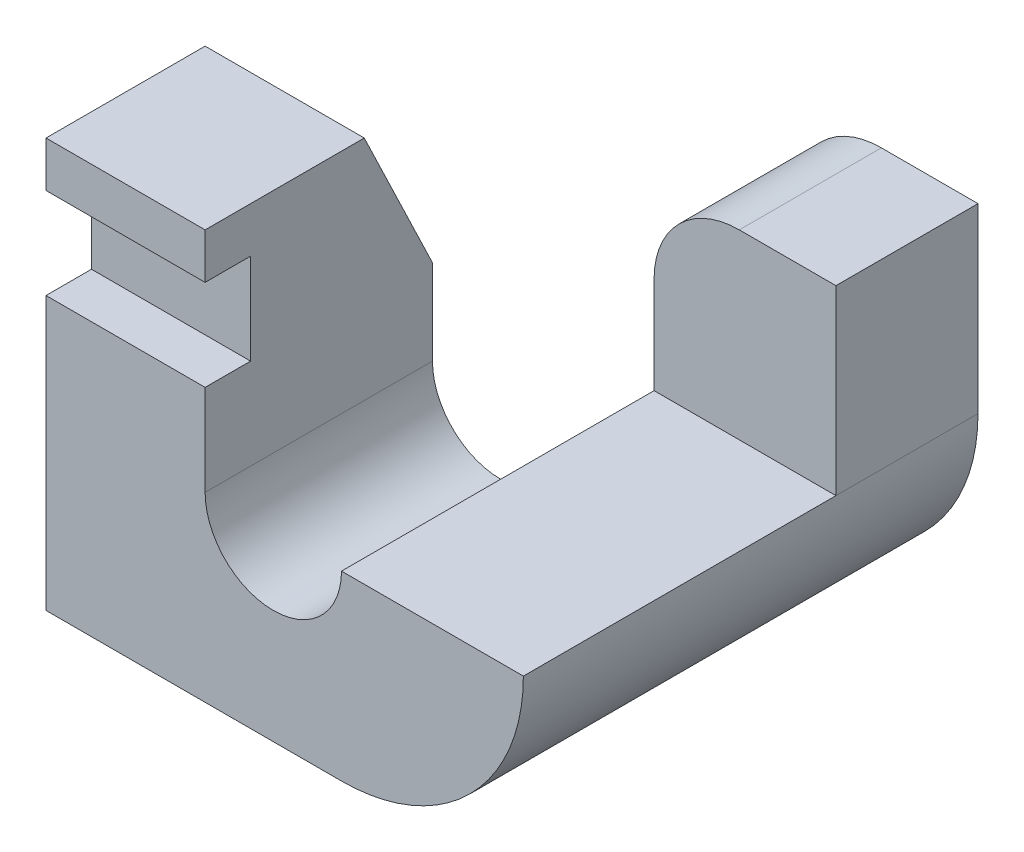
ISO-10303-21;
HEADER;
FILE_DESCRIPTION(('STEP AP214'),'2;1');
FILE_NAME('part.step','',(''),(''),'','','');
FILE_SCHEMA(('AUTOMOTIVE_DESIGN { 1 0 10303 214 1 1 1 1 }'));
ENDSEC;
DATA;
#1=APPLICATION_CONTEXT('core data for automotive mechanical design processes');
#2=APPLICATION_PROTOCOL_DEFINITION('international standard','automotive_design',2000,#1);
#3=PRODUCT_CONTEXT('',#1,'mechanical');
#4=PRODUCT('Part','Part','',(#3));
#5=PRODUCT_RELATED_PRODUCT_CATEGORY('part','',(#4));
#6=PRODUCT_DEFINITION_FORMATION('','',#4);
#7=PRODUCT_DEFINITION_CONTEXT('part definition',#1,'design');
#8=PRODUCT_DEFINITION('design','',#6,#7);
#9=PRODUCT_DEFINITION_SHAPE('','',#8);
#10=(LENGTH_UNIT() NAMED_UNIT(*) SI_UNIT(.MILLI.,.METRE.));
#11=(NAMED_UNIT(*) PLANE_ANGLE_UNIT() SI_UNIT($,.RADIAN.));
#12=(NAMED_UNIT(*) SI_UNIT($,.STERADIAN.) SOLID_ANGLE_UNIT());
#13=UNCERTAINTY_MEASURE_WITH_UNIT(LENGTH_MEASURE(1.E-05),#10,'distance_accuracy_value','');
#14=(GEOMETRIC_REPRESENTATION_CONTEXT(3) GLOBAL_UNCERTAINTY_ASSIGNED_CONTEXT((#13)) GLOBAL_UNIT_ASSIGNED_CONTEXT((#10,
#11,#12)) REPRESENTATION_CONTEXT('',''));
#15=CARTESIAN_POINT('',(0.,0.,0.));
#16=DIRECTION('',(0.,0.,1.));
#17=DIRECTION('',(1.,0.,0.));
#18=AXIS2_PLACEMENT_3D('',#15,#16,#17);
#19=CARTESIAN_POINT('',(0.,0.,80.));
#20=DIRECTION('',(1.,0.,0.));
#21=DIRECTION('',(0.,0.,-1.));
#22=AXIS2_PLACEMENT_3D('',#19,#20,#21);
#23=PLANE('',#22);
#24=DIRECTION('',(0.,0.,-1.));
#25=VECTOR('',#24,1.);
#26=CARTESIAN_POINT('',(0.,72.,80.));
#27=LINE('',#26,#25);
#28=CARTESIAN_POINT('',(0.,72.,80.));
#29=VERTEX_POINT('',#28);
#30=CARTESIAN_POINT('',(0.,72.,52.));
#31=VERTEX_POINT('',#30);
#32=EDGE_CURVE('E169',#29,#31,#27,.T.);
#33=ORIENTED_EDGE('',*,*,#32,.T.);
#34=DIRECTION('',(0.,-0.901523057468274,-0.432731067584771));
#35=VECTOR('',#34,1.);
#36=CARTESIAN_POINT('',(0.,24.405721716515,29.1547464239272));
#37=LINE('',#36,#35);
#38=CARTESIAN_POINT('',(0.,47.,40.));
#39=VERTEX_POINT('',#38);
#40=EDGE_CURVE('E149',#31,#39,#37,.T.);
#41=ORIENTED_EDGE('',*,*,#40,.T.);
#42=DIRECTION('',(0.,1.,0.));
#43=VECTOR('',#42,1.);
#44=CARTESIAN_POINT('',(0.,0.,40.));
#45=LINE('',#44,#43);
#46=CARTESIAN_POINT('',(0.,0.,40.));
#47=VERTEX_POINT('',#46);
#48=EDGE_CURVE('E262',#47,#39,#45,.T.);
#49=ORIENTED_EDGE('',*,*,#48,.F.);
#50=DIRECTION('',(0.,0.,-1.));
#51=VECTOR('',#50,1.);
#52=CARTESIAN_POINT('',(0.,0.,80.));
#53=LINE('',#52,#51);
#54=CARTESIAN_POINT('',(0.,0.,80.));
#55=VERTEX_POINT('',#54);
#56=EDGE_CURVE('E184',#55,#47,#53,.T.);
#57=ORIENTED_EDGE('',*,*,#56,.F.);
#58=DIRECTION('',(0.,-1.,0.));
#59=VECTOR('',#58,1.);
#60=CARTESIAN_POINT('',(0.,0.,80.));
#61=LINE('',#60,#59);
#62=CARTESIAN_POINT('',(0.,48.,80.));
#63=VERTEX_POINT('',#62);
#64=EDGE_CURVE('E205',#63,#55,#61,.T.);
#65=ORIENTED_EDGE('',*,*,#64,.F.);
#66=DIRECTION('',(0.,0.,1.));
#67=VECTOR('',#66,1.);
#68=CARTESIAN_POINT('',(0.,48.,80.));
#69=LINE('',#68,#67);
#70=CARTESIAN_POINT('',(0.,48.,72.));
#71=VERTEX_POINT('',#70);
#72=EDGE_CURVE('E259',#71,#63,#69,.T.);
#73=ORIENTED_EDGE('',*,*,#72,.F.);
#74=DIRECTION('',(0.,-1.,0.));
#75=VECTOR('',#74,1.);
#76=CARTESIAN_POINT('',(0.,0.,72.));
#77=LINE('',#76,#75);
#78=CARTESIAN_POINT('',(0.,64.,72.));
#79=VERTEX_POINT('',#78);
#80=EDGE_CURVE('E319',#79,#71,#77,.T.);
#81=ORIENTED_EDGE('',*,*,#80,.F.);
#82=DIRECTION('',(0.,0.,-1.));
#83=VECTOR('',#82,1.);
#84=CARTESIAN_POINT('',(0.,64.,80.));
#85=LINE('',#84,#83);
#86=CARTESIAN_POINT('',(0.,64.,80.));
#87=VERTEX_POINT('',#86);
#88=EDGE_CURVE('E322',#87,#79,#85,.T.);
#89=ORIENTED_EDGE('',*,*,#88,.F.);
#90=EDGE_CURVE('E193',#29,#87,#61,.T.);
#91=ORIENTED_EDGE('',*,*,#90,.F.);
#92=EDGE_LOOP('',(#33,#41,#49,#57,#65,#73,#81,#89,#91));
#93=FACE_BOUND('',#92,.T.);
#94=ADVANCED_FACE('F33',(#93),#23,.F.);
#95=CARTESIAN_POINT('',(28.,72.,80.));
#96=DIRECTION('',(-1.,0.,0.));
#97=DIRECTION('',(0.,-1.,0.));
#98=AXIS2_PLACEMENT_3D('',#95,#96,#97);
#99=PLANE('',#98);
#100=DIRECTION('',(0.,-1.,0.));
#101=VECTOR('',#100,1.);
#102=CARTESIAN_POINT('',(28.,72.,40.));
#103=LINE('',#102,#101);
#104=CARTESIAN_POINT('',(28.,47.,40.));
#105=VERTEX_POINT('',#104);
#106=CARTESIAN_POINT('',(28.,32.,40.));
#107=VERTEX_POINT('',#106);
#108=EDGE_CURVE('E163',#105,#107,#103,.T.);
#109=ORIENTED_EDGE('',*,*,#108,.F.);
#110=DIRECTION('',(0.,-0.901523057468274,-0.432731067584771));
#111=VECTOR('',#110,1.);
#112=CARTESIAN_POINT('',(28.,-6.8036410923277,14.1742522756827));
#113=LINE('',#112,#111);
#114=CARTESIAN_POINT('',(28.,72.,52.));
#115=VERTEX_POINT('',#114);
#116=EDGE_CURVE('E55',#115,#105,#113,.T.);
#117=ORIENTED_EDGE('',*,*,#116,.F.);
#118=DIRECTION('',(0.,0.,-1.));
#119=VECTOR('',#118,1.);
#120=CARTESIAN_POINT('',(28.,72.,80.));
#121=LINE('',#120,#119);
#122=CARTESIAN_POINT('',(28.,72.,80.));
#123=VERTEX_POINT('',#122);
#124=EDGE_CURVE('E160',#123,#115,#121,.T.);
#125=ORIENTED_EDGE('',*,*,#124,.F.);
#126=DIRECTION('',(0.,1.,0.));
#127=VECTOR('',#126,1.);
#128=CARTESIAN_POINT('',(28.,72.,80.));
#129=LINE('',#128,#127);
#130=CARTESIAN_POINT('',(28.,64.,80.));
#131=VERTEX_POINT('',#130);
#132=EDGE_CURVE('E191',#131,#123,#129,.T.);
#133=ORIENTED_EDGE('',*,*,#132,.F.);
#134=DIRECTION('',(0.,0.,-1.));
#135=VECTOR('',#134,1.);
#136=CARTESIAN_POINT('',(28.,64.,0.));
#137=LINE('',#136,#135);
#138=CARTESIAN_POINT('',(28.,64.,72.));
#139=VERTEX_POINT('',#138);
#140=EDGE_CURVE('E47',#131,#139,#137,.T.);
#141=ORIENTED_EDGE('',*,*,#140,.T.);
#142=DIRECTION('',(0.,-1.,0.));
#143=VECTOR('',#142,1.);
#144=CARTESIAN_POINT('',(28.,0.,72.));
#145=LINE('',#144,#143);
#146=CARTESIAN_POINT('',(28.,48.,72.));
#147=VERTEX_POINT('',#146);
#148=EDGE_CURVE('E329',#139,#147,#145,.T.);
#149=ORIENTED_EDGE('',*,*,#148,.T.);
#150=DIRECTION('',(0.,0.,1.));
#151=VECTOR('',#150,1.);
#152=CARTESIAN_POINT('',(28.,48.,0.));
#153=LINE('',#152,#151);
#154=CARTESIAN_POINT('',(28.,48.,80.));
#155=VERTEX_POINT('',#154);
#156=EDGE_CURVE('E251',#147,#155,#153,.T.);
#157=ORIENTED_EDGE('',*,*,#156,.T.);
#158=CARTESIAN_POINT('',(28.,32.,80.));
#159=VERTEX_POINT('',#158);
#160=EDGE_CURVE('E196',#159,#155,#129,.T.);
#161=ORIENTED_EDGE('',*,*,#160,.F.);
#162=DIRECTION('',(0.,0.,-1.));
#163=VECTOR('',#162,1.);
#164=CARTESIAN_POINT('',(28.,32.,80.));
#165=LINE('',#164,#163);
#166=EDGE_CURVE('E168',#159,#107,#165,.T.);
#167=ORIENTED_EDGE('',*,*,#166,.T.);
#168=EDGE_LOOP('',(#109,#117,#125,#133,#141,#149,#157,#161,#167));
#169=FACE_BOUND('',#168,.T.);
#170=ADVANCED_FACE('F158',(#169),#99,.F.);
#171=CARTESIAN_POINT('',(40.,32.,80.));
#172=DIRECTION('',(0.,0.,1.));
#173=DIRECTION('',(1.,0.,0.));
#174=AXIS2_PLACEMENT_3D('',#171,#172,#173);
#175=PLANE('',#174);
#176=ORIENTED_EDGE('',*,*,#160,.T.);
#177=DIRECTION('',(-1.,0.,0.));
#178=VECTOR('',#177,1.);
#179=CARTESIAN_POINT('',(40.,48.,80.));
#180=LINE('',#179,#178);
#181=EDGE_CURVE('E11',#155,#63,#180,.T.);
#182=ORIENTED_EDGE('',*,*,#181,.T.);
#183=ORIENTED_EDGE('',*,*,#64,.T.);
#184=DIRECTION('',(1.,0.,0.));
#185=VECTOR('',#184,1.);
#186=CARTESIAN_POINT('',(0.,0.,80.));
#187=LINE('',#186,#185);
#188=CARTESIAN_POINT('',(52.,0.,80.));
#189=VERTEX_POINT('',#188);
#190=EDGE_CURVE('E228',#55,#189,#187,.T.);
#191=ORIENTED_EDGE('',*,*,#190,.T.);
#192=CARTESIAN_POINT('',(52.,32.,80.));
#193=DIRECTION('',(0.,0.,1.));
#194=DIRECTION('',(1.,0.,0.));
#195=AXIS2_PLACEMENT_3D('',#192,#193,#194);
#196=CIRCLE('',#195,32.);
#197=CARTESIAN_POINT('',(84.,32.,80.));
#198=VERTEX_POINT('',#197);
#199=EDGE_CURVE('E230',#189,#198,#196,.T.);
#200=ORIENTED_EDGE('',*,*,#199,.T.);
#201=DIRECTION('',(-1.,0.,0.));
#202=VECTOR('',#201,1.);
#203=CARTESIAN_POINT('',(52.,32.,80.));
#204=LINE('',#203,#202);
#205=CARTESIAN_POINT('',(52.,32.,80.));
#206=VERTEX_POINT('',#205);
#207=EDGE_CURVE('E200',#198,#206,#204,.T.);
#208=ORIENTED_EDGE('',*,*,#207,.T.);
#209=CARTESIAN_POINT('',(40.,32.,80.));
#210=DIRECTION('',(0.,0.,-1.));
#211=DIRECTION('',(1.,0.,0.));
#212=AXIS2_PLACEMENT_3D('',#209,#210,#211);
#213=CIRCLE('',#212,12.);
#214=EDGE_CURVE('E197',#206,#159,#213,.T.);
#215=ORIENTED_EDGE('',*,*,#214,.T.);
#216=EDGE_LOOP('',(#176,#182,#183,#191,#200,#208,#215));
#217=FACE_BOUND('',#216,.T.);
#218=ADVANCED_FACE('F234',(#217),#175,.T.);
#219=ORIENTED_EDGE('',*,*,#90,.T.);
#220=DIRECTION('',(1.,0.,0.));
#221=VECTOR('',#220,1.);
#222=CARTESIAN_POINT('',(40.,64.,80.));
#223=LINE('',#222,#221);
#224=EDGE_CURVE('E40',#87,#131,#223,.T.);
#225=ORIENTED_EDGE('',*,*,#224,.T.);
#226=ORIENTED_EDGE('',*,*,#132,.T.);
#227=DIRECTION('',(-1.,0.,0.));
#228=VECTOR('',#227,1.);
#229=CARTESIAN_POINT('',(0.,72.,80.));
#230=LINE('',#229,#228);
#231=EDGE_CURVE('E167',#123,#29,#230,.T.);
#232=ORIENTED_EDGE('',*,*,#231,.T.);
#233=EDGE_LOOP('',(#219,#225,#226,#232));
#234=FACE_BOUND('',#233,.T.);
#235=ADVANCED_FACE('F190',(#234),#175,.T.);
#236=CARTESIAN_POINT('',(0.,0.,80.));
#237=DIRECTION('',(0.,1.,0.));
#238=DIRECTION('',(-1.,0.,0.));
#239=AXIS2_PLACEMENT_3D('',#236,#237,#238);
#240=PLANE('',#239);
#241=DIRECTION('',(-1.,0.,0.));
#242=VECTOR('',#241,1.);
#243=CARTESIAN_POINT('',(0.,0.,40.));
#244=LINE('',#243,#242);
#245=CARTESIAN_POINT('',(52.,0.,40.));
#246=VERTEX_POINT('',#245);
#247=EDGE_CURVE('E267',#246,#47,#244,.T.);
#248=ORIENTED_EDGE('',*,*,#247,.F.);
#249=DIRECTION('',(0.,0.,-1.));
#250=VECTOR('',#249,1.);
#251=CARTESIAN_POINT('',(52.,0.,80.));
#252=LINE('',#251,#250);
#253=EDGE_CURVE('E181',#189,#246,#252,.T.);
#254=ORIENTED_EDGE('',*,*,#253,.F.);
#255=ORIENTED_EDGE('',*,*,#190,.F.);
#256=ORIENTED_EDGE('',*,*,#56,.T.);
#257=EDGE_LOOP('',(#248,#254,#255,#256));
#258=FACE_BOUND('',#257,.T.);
#259=ADVANCED_FACE('F265',(#258),#240,.F.);
#260=CARTESIAN_POINT('',(40.,32.,80.));
#261=DIRECTION('',(0.,0.,-1.));
#262=DIRECTION('',(-1.,0.,0.));
#263=AXIS2_PLACEMENT_3D('',#260,#261,#262);
#264=CYLINDRICAL_SURFACE('',#263,12.);
#265=CARTESIAN_POINT('',(40.,32.,40.));
#266=DIRECTION('',(0.,0.,-1.));
#267=DIRECTION('',(-1.,0.,0.));
#268=AXIS2_PLACEMENT_3D('',#265,#266,#267);
#269=CIRCLE('',#268,12.);
#270=CARTESIAN_POINT('',(52.,32.,40.));
#271=VERTEX_POINT('',#270);
#272=EDGE_CURVE('E248',#107,#271,#269,.F.);
#273=ORIENTED_EDGE('',*,*,#272,.F.);
#274=ORIENTED_EDGE('',*,*,#166,.F.);
#275=ORIENTED_EDGE('',*,*,#214,.F.);
#276=DIRECTION('',(0.,0.,-1.));
#277=VECTOR('',#276,1.);
#278=CARTESIAN_POINT('',(52.,32.,80.));
#279=LINE('',#278,#277);
#280=EDGE_CURVE('E171',#206,#271,#279,.T.);
#281=ORIENTED_EDGE('',*,*,#280,.T.);
#282=EDGE_LOOP('',(#273,#274,#275,#281));
#283=FACE_BOUND('',#282,.T.);
#284=ADVANCED_FACE('F246',(#283),#264,.F.);
#285=CARTESIAN_POINT('',(0.,72.,80.));
#286=DIRECTION('',(0.,-1.,0.));
#287=DIRECTION('',(0.,0.,-1.));
#288=AXIS2_PLACEMENT_3D('',#285,#286,#287);
#289=PLANE('',#288);
#290=ORIENTED_EDGE('',*,*,#124,.T.);
#291=DIRECTION('',(1.,0.,0.));
#292=VECTOR('',#291,1.);
#293=CARTESIAN_POINT('',(-27.,72.,52.));
#294=LINE('',#293,#292);
#295=EDGE_CURVE('E146',#31,#115,#294,.T.);
#296=ORIENTED_EDGE('',*,*,#295,.F.);
#297=ORIENTED_EDGE('',*,*,#32,.F.);
#298=ORIENTED_EDGE('',*,*,#231,.F.);
#299=EDGE_LOOP('',(#290,#296,#297,#298));
#300=FACE_BOUND('',#299,.T.);
#301=ADVANCED_FACE('F166',(#300),#289,.F.);
#302=CARTESIAN_POINT('',(52.,32.,80.));
#303=DIRECTION('',(0.,-1.,0.));
#304=DIRECTION('',(1.,0.,0.));
#305=AXIS2_PLACEMENT_3D('',#302,#303,#304);
#306=PLANE('',#305);
#307=DIRECTION('',(-1.,0.,0.));
#308=VECTOR('',#307,1.);
#309=CARTESIAN_POINT('',(52.,32.,25.));
#310=LINE('',#309,#308);
#311=CARTESIAN_POINT('',(84.,32.,25.));
#312=VERTEX_POINT('',#311);
#313=CARTESIAN_POINT('',(52.,32.,25.));
#314=VERTEX_POINT('',#313);
#315=EDGE_CURVE('E270',#312,#314,#310,.T.);
#316=ORIENTED_EDGE('',*,*,#315,.T.);
#317=DIRECTION('',(0.,0.,-1.));
#318=VECTOR('',#317,1.);
#319=CARTESIAN_POINT('',(52.,32.,80.));
#320=LINE('',#319,#318);
#321=EDGE_CURVE('E243',#314,#271,#320,.F.);
#322=ORIENTED_EDGE('',*,*,#321,.T.);
#323=ORIENTED_EDGE('',*,*,#280,.F.);
#324=ORIENTED_EDGE('',*,*,#207,.F.);
#325=DIRECTION('',(0.,0.,-1.));
#326=VECTOR('',#325,1.);
#327=CARTESIAN_POINT('',(84.,32.,80.));
#328=LINE('',#327,#326);
#329=EDGE_CURVE('E178',#198,#312,#328,.T.);
#330=ORIENTED_EDGE('',*,*,#329,.T.);
#331=EDGE_LOOP('',(#316,#322,#323,#324,#330));
#332=FACE_BOUND('',#331,.T.);
#333=ADVANCED_FACE('F242',(#332),#306,.F.);
#334=CARTESIAN_POINT('',(52.,32.,80.));
#335=DIRECTION('',(0.,0.,-1.));
#336=DIRECTION('',(-1.,0.,0.));
#337=AXIS2_PLACEMENT_3D('',#334,#335,#336);
#338=CYLINDRICAL_SURFACE('',#337,32.);
#339=CARTESIAN_POINT('',(52.,32.,0.));
#340=DIRECTION('',(0.,0.,1.));
#341=DIRECTION('',(1.,0.,0.));
#342=AXIS2_PLACEMENT_3D('',#339,#340,#341);
#343=CIRCLE('',#342,32.);
#344=CARTESIAN_POINT('',(52.,0.,0.));
#345=VERTEX_POINT('',#344);
#346=CARTESIAN_POINT('',(84.,32.,0.));
#347=VERTEX_POINT('',#346);
#348=EDGE_CURVE('E204',#345,#347,#343,.T.);
#349=ORIENTED_EDGE('',*,*,#348,.T.);
#350=DIRECTION('',(0.,0.,-1.));
#351=VECTOR('',#350,1.);
#352=CARTESIAN_POINT('',(84.,32.,25.));
#353=LINE('',#352,#351);
#354=EDGE_CURVE('E225',#312,#347,#353,.T.);
#355=ORIENTED_EDGE('',*,*,#354,.F.);
#356=ORIENTED_EDGE('',*,*,#329,.F.);
#357=ORIENTED_EDGE('',*,*,#199,.F.);
#358=ORIENTED_EDGE('',*,*,#253,.T.);
#359=DIRECTION('',(0.,0.,-1.));
#360=VECTOR('',#359,1.);
#361=CARTESIAN_POINT('',(52.,0.,0.));
#362=LINE('',#361,#360);
#363=EDGE_CURVE('E315',#246,#345,#362,.T.);
#364=ORIENTED_EDGE('',*,*,#363,.T.);
#365=EDGE_LOOP('',(#349,#355,#356,#357,#358,#364));
#366=FACE_BOUND('',#365,.T.);
#367=ADVANCED_FACE('F268',(#366),#338,.T.);
#368=CARTESIAN_POINT('',(40.,32.,0.));
#369=DIRECTION('',(0.,0.,1.));
#370=DIRECTION('',(1.,0.,0.));
#371=AXIS2_PLACEMENT_3D('',#368,#369,#370);
#372=PLANE('',#371);
#373=ORIENTED_EDGE('',*,*,#348,.F.);
#374=DIRECTION('',(0.,1.,0.));
#375=VECTOR('',#374,1.);
#376=CARTESIAN_POINT('',(52.,32.,0.));
#377=LINE('',#376,#375);
#378=CARTESIAN_POINT('',(52.,49.,0.));
#379=VERTEX_POINT('',#378);
#380=EDGE_CURVE('E298',#345,#379,#377,.T.);
#381=ORIENTED_EDGE('',*,*,#380,.T.);
#382=CARTESIAN_POINT('',(67.,49.,0.));
#383=DIRECTION('',(0.,0.,-1.));
#384=DIRECTION('',(-1.,0.,0.));
#385=AXIS2_PLACEMENT_3D('',#382,#383,#384);
#386=CIRCLE('',#385,15.);
#387=CARTESIAN_POINT('',(67.,64.,0.));
#388=VERTEX_POINT('',#387);
#389=EDGE_CURVE('E287',#379,#388,#386,.T.);
#390=ORIENTED_EDGE('',*,*,#389,.T.);
#391=DIRECTION('',(1.,0.,0.));
#392=VECTOR('',#391,1.);
#393=CARTESIAN_POINT('',(67.,64.,0.));
#394=LINE('',#393,#392);
#395=CARTESIAN_POINT('',(84.,64.,0.));
#396=VERTEX_POINT('',#395);
#397=EDGE_CURVE('E221',#388,#396,#394,.T.);
#398=ORIENTED_EDGE('',*,*,#397,.T.);
#399=DIRECTION('',(0.,-1.,0.));
#400=VECTOR('',#399,1.);
#401=CARTESIAN_POINT('',(84.,64.,0.));
#402=LINE('',#401,#400);
#403=EDGE_CURVE('E296',#396,#347,#402,.T.);
#404=ORIENTED_EDGE('',*,*,#403,.T.);
#405=EDGE_LOOP('',(#373,#381,#390,#398,#404));
#406=FACE_BOUND('',#405,.T.);
#407=ADVANCED_FACE('F303',(#406),#372,.F.);
#408=CARTESIAN_POINT('',(84.,64.,25.));
#409=DIRECTION('',(1.,0.,0.));
#410=DIRECTION('',(0.,0.,-1.));
#411=AXIS2_PLACEMENT_3D('',#408,#409,#410);
#412=PLANE('',#411);
#413=ORIENTED_EDGE('',*,*,#403,.F.);
#414=DIRECTION('',(0.,0.,-1.));
#415=VECTOR('',#414,1.);
#416=CARTESIAN_POINT('',(84.,64.,25.));
#417=LINE('',#416,#415);
#418=CARTESIAN_POINT('',(84.,64.,25.));
#419=VERTEX_POINT('',#418);
#420=EDGE_CURVE('E206',#419,#396,#417,.T.);
#421=ORIENTED_EDGE('',*,*,#420,.F.);
#422=DIRECTION('',(0.,-1.,0.));
#423=VECTOR('',#422,1.);
#424=CARTESIAN_POINT('',(84.,64.,25.));
#425=LINE('',#424,#423);
#426=EDGE_CURVE('E277',#419,#312,#425,.T.);
#427=ORIENTED_EDGE('',*,*,#426,.T.);
#428=ORIENTED_EDGE('',*,*,#354,.T.);
#429=EDGE_LOOP('',(#413,#421,#427,#428));
#430=FACE_BOUND('',#429,.T.);
#431=ADVANCED_FACE('F283',(#430),#412,.T.);
#432=CARTESIAN_POINT('',(67.,64.,25.));
#433=DIRECTION('',(0.,1.,0.));
#434=DIRECTION('',(0.,0.,1.));
#435=AXIS2_PLACEMENT_3D('',#432,#433,#434);
#436=PLANE('',#435);
#437=ORIENTED_EDGE('',*,*,#397,.F.);
#438=DIRECTION('',(0.,0.,-1.));
#439=VECTOR('',#438,1.);
#440=CARTESIAN_POINT('',(67.,64.,25.));
#441=LINE('',#440,#439);
#442=CARTESIAN_POINT('',(67.,64.,25.));
#443=VERTEX_POINT('',#442);
#444=EDGE_CURVE('E212',#443,#388,#441,.T.);
#445=ORIENTED_EDGE('',*,*,#444,.F.);
#446=DIRECTION('',(1.,0.,0.));
#447=VECTOR('',#446,1.);
#448=CARTESIAN_POINT('',(67.,64.,25.));
#449=LINE('',#448,#447);
#450=EDGE_CURVE('E226',#443,#419,#449,.T.);
#451=ORIENTED_EDGE('',*,*,#450,.T.);
#452=ORIENTED_EDGE('',*,*,#420,.T.);
#453=EDGE_LOOP('',(#437,#445,#451,#452));
#454=FACE_BOUND('',#453,.T.);
#455=ADVANCED_FACE('F305',(#454),#436,.T.);
#456=CARTESIAN_POINT('',(67.,49.,25.));
#457=DIRECTION('',(0.,0.,-1.));
#458=DIRECTION('',(-1.,0.,0.));
#459=AXIS2_PLACEMENT_3D('',#456,#457,#458);
#460=CYLINDRICAL_SURFACE('',#459,15.);
#461=ORIENTED_EDGE('',*,*,#389,.F.);
#462=DIRECTION('',(0.,0.,-1.));
#463=VECTOR('',#462,1.);
#464=CARTESIAN_POINT('',(52.,49.,25.));
#465=LINE('',#464,#463);
#466=CARTESIAN_POINT('',(52.,49.,25.));
#467=VERTEX_POINT('',#466);
#468=EDGE_CURVE('E218',#467,#379,#465,.T.);
#469=ORIENTED_EDGE('',*,*,#468,.F.);
#470=CARTESIAN_POINT('',(67.,49.,25.));
#471=DIRECTION('',(0.,0.,-1.));
#472=DIRECTION('',(-1.,0.,0.));
#473=AXIS2_PLACEMENT_3D('',#470,#471,#472);
#474=CIRCLE('',#473,15.);
#475=EDGE_CURVE('E292',#467,#443,#474,.T.);
#476=ORIENTED_EDGE('',*,*,#475,.T.);
#477=ORIENTED_EDGE('',*,*,#444,.T.);
#478=EDGE_LOOP('',(#461,#469,#476,#477));
#479=FACE_BOUND('',#478,.T.);
#480=ADVANCED_FACE('F306',(#479),#460,.T.);
#481=CARTESIAN_POINT('',(52.,32.,25.));
#482=DIRECTION('',(-1.,0.,0.));
#483=DIRECTION('',(0.,0.,1.));
#484=AXIS2_PLACEMENT_3D('',#481,#482,#483);
#485=PLANE('',#484);
#486=ORIENTED_EDGE('',*,*,#380,.F.);
#487=ORIENTED_EDGE('',*,*,#363,.F.);
#488=DIRECTION('',(0.,1.,0.));
#489=VECTOR('',#488,1.);
#490=CARTESIAN_POINT('',(52.,0.,40.));
#491=LINE('',#490,#489);
#492=EDGE_CURVE('E311',#246,#271,#491,.T.);
#493=ORIENTED_EDGE('',*,*,#492,.T.);
#494=ORIENTED_EDGE('',*,*,#321,.F.);
#495=DIRECTION('',(0.,1.,0.));
#496=VECTOR('',#495,1.);
#497=CARTESIAN_POINT('',(52.,32.,25.));
#498=LINE('',#497,#496);
#499=EDGE_CURVE('E280',#314,#467,#498,.T.);
#500=ORIENTED_EDGE('',*,*,#499,.T.);
#501=ORIENTED_EDGE('',*,*,#468,.T.);
#502=EDGE_LOOP('',(#486,#487,#493,#494,#500,#501));
#503=FACE_BOUND('',#502,.T.);
#504=ADVANCED_FACE('F308',(#503),#485,.T.);
#505=CARTESIAN_POINT('',(67.,49.,25.));
#506=DIRECTION('',(0.,0.,-1.));
#507=DIRECTION('',(-1.,0.,0.));
#508=AXIS2_PLACEMENT_3D('',#505,#506,#507);
#509=PLANE('',#508);
#510=ORIENTED_EDGE('',*,*,#426,.F.);
#511=ORIENTED_EDGE('',*,*,#450,.F.);
#512=ORIENTED_EDGE('',*,*,#475,.F.);
#513=ORIENTED_EDGE('',*,*,#499,.F.);
#514=ORIENTED_EDGE('',*,*,#315,.F.);
#515=EDGE_LOOP('',(#510,#511,#512,#513,#514));
#516=FACE_BOUND('',#515,.T.);
#517=ADVANCED_FACE('F275',(#516),#509,.F.);
#518=CARTESIAN_POINT('',(0.,0.,40.));
#519=DIRECTION('',(0.,0.,-1.));
#520=DIRECTION('',(-1.,0.,0.));
#521=AXIS2_PLACEMENT_3D('',#518,#519,#520);
#522=PLANE('',#521);
#523=DIRECTION('',(-1.,0.,0.));
#524=VECTOR('',#523,1.);
#525=CARTESIAN_POINT('',(0.,47.,40.));
#526=LINE('',#525,#524);
#527=EDGE_CURVE('E187',#105,#39,#526,.T.);
#528=ORIENTED_EDGE('',*,*,#527,.F.);
#529=ORIENTED_EDGE('',*,*,#108,.T.);
#530=ORIENTED_EDGE('',*,*,#272,.T.);
#531=ORIENTED_EDGE('',*,*,#492,.F.);
#532=ORIENTED_EDGE('',*,*,#247,.T.);
#533=ORIENTED_EDGE('',*,*,#48,.T.);
#534=EDGE_LOOP('',(#528,#529,#530,#531,#532,#533));
#535=FACE_BOUND('',#534,.T.);
#536=ADVANCED_FACE('F389',(#535),#522,.T.);
#537=CARTESIAN_POINT('',(-27.,-6.8036410923277,14.1742522756827));
#538=DIRECTION('',(0.,-0.432731067584771,0.901523057468274));
#539=DIRECTION('',(0.,-0.901523057468274,-0.432731067584771));
#540=AXIS2_PLACEMENT_3D('',#537,#538,#539);
#541=PLANE('',#540);
#542=ORIENTED_EDGE('',*,*,#295,.T.);
#543=ORIENTED_EDGE('',*,*,#116,.T.);
#544=ORIENTED_EDGE('',*,*,#527,.T.);
#545=ORIENTED_EDGE('',*,*,#40,.F.);
#546=EDGE_LOOP('',(#542,#543,#544,#545));
#547=FACE_BOUND('',#546,.T.);
#548=ADVANCED_FACE('F147',(#547),#541,.F.);
#549=CARTESIAN_POINT('',(-27.,0.,72.));
#550=DIRECTION('',(0.,0.,1.));
#551=DIRECTION('',(1.,0.,0.));
#552=AXIS2_PLACEMENT_3D('',#549,#550,#551);
#553=PLANE('',#552);
#554=ORIENTED_EDGE('',*,*,#80,.T.);
#555=DIRECTION('',(1.,0.,0.));
#556=VECTOR('',#555,1.);
#557=CARTESIAN_POINT('',(-27.,48.,72.));
#558=LINE('',#557,#556);
#559=EDGE_CURVE('E325',#71,#147,#558,.T.);
#560=ORIENTED_EDGE('',*,*,#559,.T.);
#561=ORIENTED_EDGE('',*,*,#148,.F.);
#562=DIRECTION('',(1.,0.,0.));
#563=VECTOR('',#562,1.);
#564=CARTESIAN_POINT('',(-27.,64.,72.));
#565=LINE('',#564,#563);
#566=EDGE_CURVE('E164',#79,#139,#565,.T.);
#567=ORIENTED_EDGE('',*,*,#566,.F.);
#568=EDGE_LOOP('',(#554,#560,#561,#567));
#569=FACE_BOUND('',#568,.T.);
#570=ADVANCED_FACE('F334',(#569),#553,.T.);
#571=CARTESIAN_POINT('',(-27.,48.,0.));
#572=DIRECTION('',(0.,1.,0.));
#573=DIRECTION('',(-1.,0.,0.));
#574=AXIS2_PLACEMENT_3D('',#571,#572,#573);
#575=PLANE('',#574);
#576=ORIENTED_EDGE('',*,*,#72,.T.);
#577=ORIENTED_EDGE('',*,*,#181,.F.);
#578=ORIENTED_EDGE('',*,*,#156,.F.);
#579=ORIENTED_EDGE('',*,*,#559,.F.);
#580=EDGE_LOOP('',(#576,#577,#578,#579));
#581=FACE_BOUND('',#580,.T.);
#582=ADVANCED_FACE('F336',(#581),#575,.T.);
#583=CARTESIAN_POINT('',(-27.,64.,0.));
#584=DIRECTION('',(0.,-1.,0.));
#585=DIRECTION('',(1.,0.,0.));
#586=AXIS2_PLACEMENT_3D('',#583,#584,#585);
#587=PLANE('',#586);
#588=ORIENTED_EDGE('',*,*,#88,.T.);
#589=ORIENTED_EDGE('',*,*,#566,.T.);
#590=ORIENTED_EDGE('',*,*,#140,.F.);
#591=ORIENTED_EDGE('',*,*,#224,.F.);
#592=EDGE_LOOP('',(#588,#589,#590,#591));
#593=FACE_BOUND('',#592,.T.);
#594=ADVANCED_FACE('F338',(#593),#587,.T.);
#595=CLOSED_SHELL('',(#94,#170,#218,#235,#259,#284,#301,#333,#367,#407,#431,#455,#480,#504,#517,
#536,#548,#570,#582,#594));
#596=MANIFOLD_SOLID_BREP('B2',#595);
#597=ADVANCED_BREP_SHAPE_REPRESENTATION('',(#18,#596),#14);
#598=SHAPE_DEFINITION_REPRESENTATION(#9,#597);
ENDSEC;
END-ISO-10303-21;
